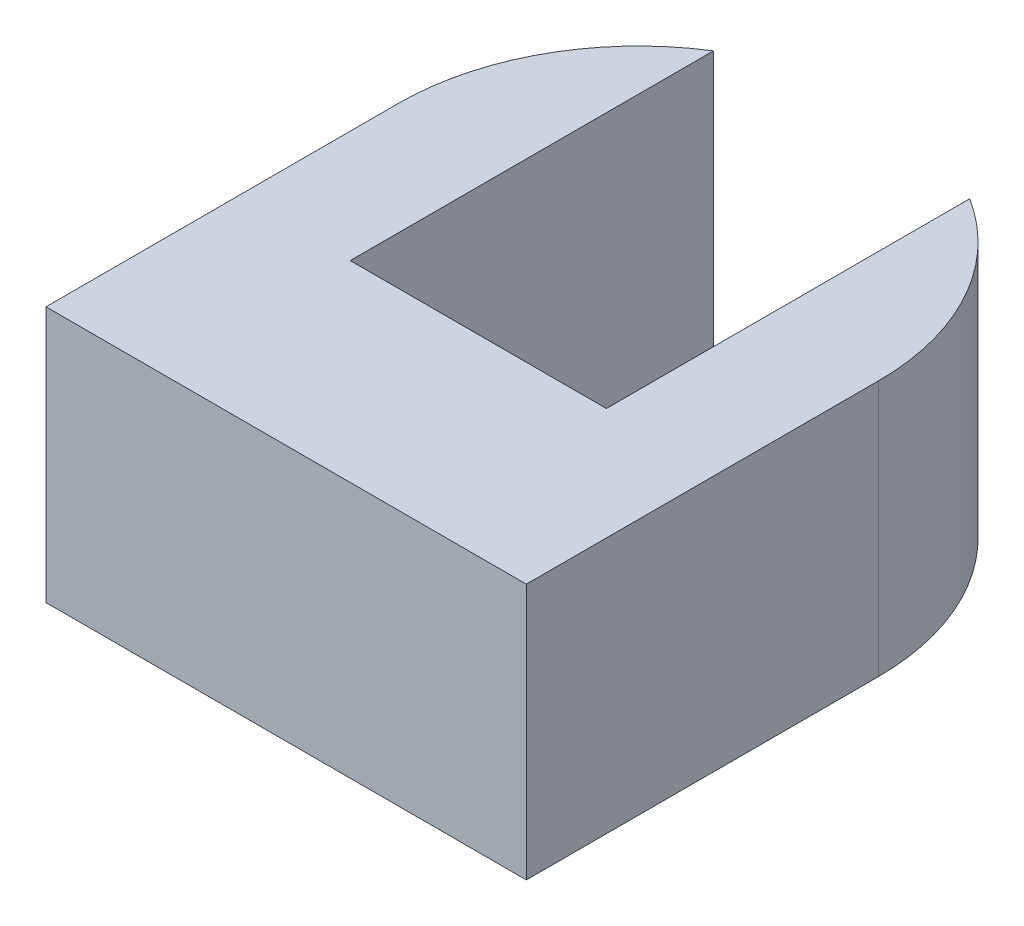
ISO-10303-21;
HEADER;
FILE_DESCRIPTION(('STEP AP214'),'2;1');
FILE_NAME('part.step','',(''),(''),'','','');
FILE_SCHEMA(('AUTOMOTIVE_DESIGN { 1 0 10303 214 1 1 1 1 }'));
ENDSEC;
DATA;
#1=APPLICATION_CONTEXT('core data for automotive mechanical design processes');
#2=APPLICATION_PROTOCOL_DEFINITION('international standard','automotive_design',2000,#1);
#3=PRODUCT_CONTEXT('',#1,'mechanical');
#4=PRODUCT('Part','Part','',(#3));
#5=PRODUCT_RELATED_PRODUCT_CATEGORY('part','',(#4));
#6=PRODUCT_DEFINITION_FORMATION('','',#4);
#7=PRODUCT_DEFINITION_CONTEXT('part definition',#1,'design');
#8=PRODUCT_DEFINITION('design','',#6,#7);
#9=PRODUCT_DEFINITION_SHAPE('','',#8);
#10=(LENGTH_UNIT() NAMED_UNIT(*) SI_UNIT(.MILLI.,.METRE.));
#11=(NAMED_UNIT(*) PLANE_ANGLE_UNIT() SI_UNIT($,.RADIAN.));
#12=(NAMED_UNIT(*) SI_UNIT($,.STERADIAN.) SOLID_ANGLE_UNIT());
#13=UNCERTAINTY_MEASURE_WITH_UNIT(LENGTH_MEASURE(1.E-05),#10,'distance_accuracy_value','');
#14=(GEOMETRIC_REPRESENTATION_CONTEXT(3) GLOBAL_UNCERTAINTY_ASSIGNED_CONTEXT((#13)) GLOBAL_UNIT_ASSIGNED_CONTEXT((#10,
#11,#12)) REPRESENTATION_CONTEXT('',''));
#15=CARTESIAN_POINT('',(0.,0.,0.));
#16=DIRECTION('',(0.,0.,1.));
#17=DIRECTION('',(1.,0.,0.));
#18=AXIS2_PLACEMENT_3D('',#15,#16,#17);
#19=CARTESIAN_POINT('',(7.49999999999999,8.,-11.));
#20=DIRECTION('',(0.,-1.,0.));
#21=DIRECTION('',(0.,0.,-1.));
#22=AXIS2_PLACEMENT_3D('',#19,#20,#21);
#23=CYLINDRICAL_SURFACE('',#22,7.5);
#24=CARTESIAN_POINT('',(7.49999999999999,0.,-11.));
#25=DIRECTION('',(0.,1.,0.));
#26=DIRECTION('',(0.,0.,-1.));
#27=AXIS2_PLACEMENT_3D('',#24,#25,#26);
#28=CIRCLE('',#27,7.5);
#29=CARTESIAN_POINT('',(3.49999999999999,0.,-17.3442887702248));
#30=VERTEX_POINT('',#29);
#31=CARTESIAN_POINT('',(0.,0.,-11.));
#32=VERTEX_POINT('',#31);
#33=EDGE_CURVE('E129',#30,#32,#28,.T.);
#34=ORIENTED_EDGE('',*,*,#33,.T.);
#35=DIRECTION('',(0.,-1.,0.));
#36=VECTOR('',#35,1.);
#37=CARTESIAN_POINT('',(0.,8.,-11.));
#38=LINE('',#37,#36);
#39=CARTESIAN_POINT('',(0.,8.,-11.));
#40=VERTEX_POINT('',#39);
#41=EDGE_CURVE('E11',#40,#32,#38,.T.);
#42=ORIENTED_EDGE('',*,*,#41,.F.);
#43=CARTESIAN_POINT('',(7.49999999999999,8.,-11.));
#44=DIRECTION('',(0.,1.,0.));
#45=DIRECTION('',(0.,0.,-1.));
#46=AXIS2_PLACEMENT_3D('',#43,#44,#45);
#47=CIRCLE('',#46,7.5);
#48=CARTESIAN_POINT('',(3.49999999999999,8.,-17.3442887702248));
#49=VERTEX_POINT('',#48);
#50=EDGE_CURVE('E143',#49,#40,#47,.T.);
#51=ORIENTED_EDGE('',*,*,#50,.F.);
#52=DIRECTION('',(0.,-1.,0.));
#53=VECTOR('',#52,1.);
#54=CARTESIAN_POINT('',(3.49999999999999,8.,-17.3442887702248));
#55=LINE('',#54,#53);
#56=EDGE_CURVE('E125',#49,#30,#55,.T.);
#57=ORIENTED_EDGE('',*,*,#56,.T.);
#58=EDGE_LOOP('',(#34,#42,#51,#57));
#59=FACE_BOUND('',#58,.T.);
#60=ADVANCED_FACE('F33',(#59),#23,.T.);
#61=CARTESIAN_POINT('',(0.,8.,-11.));
#62=DIRECTION('',(1.,0.,0.));
#63=DIRECTION('',(0.,0.,-1.));
#64=AXIS2_PLACEMENT_3D('',#61,#62,#63);
#65=PLANE('',#64);
#66=DIRECTION('',(0.,0.,1.));
#67=VECTOR('',#66,1.);
#68=CARTESIAN_POINT('',(0.,0.,-11.));
#69=LINE('',#68,#67);
#70=CARTESIAN_POINT('',(0.,0.,0.));
#71=VERTEX_POINT('',#70);
#72=EDGE_CURVE('E132',#32,#71,#69,.T.);
#73=ORIENTED_EDGE('',*,*,#72,.T.);
#74=DIRECTION('',(0.,-1.,0.));
#75=VECTOR('',#74,1.);
#76=CARTESIAN_POINT('',(0.,8.,0.));
#77=LINE('',#76,#75);
#78=CARTESIAN_POINT('',(0.,8.,0.));
#79=VERTEX_POINT('',#78);
#80=EDGE_CURVE('E41',#79,#71,#77,.T.);
#81=ORIENTED_EDGE('',*,*,#80,.F.);
#82=DIRECTION('',(0.,0.,1.));
#83=VECTOR('',#82,1.);
#84=CARTESIAN_POINT('',(0.,8.,-11.));
#85=LINE('',#84,#83);
#86=EDGE_CURVE('E92',#40,#79,#85,.T.);
#87=ORIENTED_EDGE('',*,*,#86,.F.);
#88=ORIENTED_EDGE('',*,*,#41,.T.);
#89=EDGE_LOOP('',(#73,#81,#87,#88));
#90=FACE_BOUND('',#89,.T.);
#91=ADVANCED_FACE('F178',(#90),#65,.F.);
#92=CARTESIAN_POINT('',(0.,8.,0.));
#93=DIRECTION('',(0.,0.,-1.));
#94=DIRECTION('',(-1.,0.,0.));
#95=AXIS2_PLACEMENT_3D('',#92,#93,#94);
#96=PLANE('',#95);
#97=DIRECTION('',(1.,0.,0.));
#98=VECTOR('',#97,1.);
#99=CARTESIAN_POINT('',(0.,0.,0.));
#100=LINE('',#99,#98);
#101=CARTESIAN_POINT('',(15.,0.,0.));
#102=VERTEX_POINT('',#101);
#103=EDGE_CURVE('E134',#71,#102,#100,.T.);
#104=ORIENTED_EDGE('',*,*,#103,.T.);
#105=DIRECTION('',(0.,-1.,0.));
#106=VECTOR('',#105,1.);
#107=CARTESIAN_POINT('',(15.,8.,0.));
#108=LINE('',#107,#106);
#109=CARTESIAN_POINT('',(15.,8.,0.));
#110=VERTEX_POINT('',#109);
#111=EDGE_CURVE('E150',#110,#102,#108,.T.);
#112=ORIENTED_EDGE('',*,*,#111,.F.);
#113=DIRECTION('',(1.,0.,0.));
#114=VECTOR('',#113,1.);
#115=CARTESIAN_POINT('',(0.,8.,0.));
#116=LINE('',#115,#114);
#117=EDGE_CURVE('E158',#79,#110,#116,.T.);
#118=ORIENTED_EDGE('',*,*,#117,.F.);
#119=ORIENTED_EDGE('',*,*,#80,.T.);
#120=EDGE_LOOP('',(#104,#112,#118,#119));
#121=FACE_BOUND('',#120,.T.);
#122=ADVANCED_FACE('F156',(#121),#96,.F.);
#123=CARTESIAN_POINT('',(15.,8.,0.));
#124=DIRECTION('',(-1.,0.,0.));
#125=DIRECTION('',(0.,0.,1.));
#126=AXIS2_PLACEMENT_3D('',#123,#124,#125);
#127=PLANE('',#126);
#128=DIRECTION('',(0.,0.,-1.));
#129=VECTOR('',#128,1.);
#130=CARTESIAN_POINT('',(15.,0.,0.));
#131=LINE('',#130,#129);
#132=CARTESIAN_POINT('',(15.,0.,-11.));
#133=VERTEX_POINT('',#132);
#134=EDGE_CURVE('E136',#102,#133,#131,.T.);
#135=ORIENTED_EDGE('',*,*,#134,.T.);
#136=DIRECTION('',(0.,-1.,0.));
#137=VECTOR('',#136,1.);
#138=CARTESIAN_POINT('',(15.,8.,-11.));
#139=LINE('',#138,#137);
#140=CARTESIAN_POINT('',(15.,8.,-11.));
#141=VERTEX_POINT('',#140);
#142=EDGE_CURVE('E147',#141,#133,#139,.T.);
#143=ORIENTED_EDGE('',*,*,#142,.F.);
#144=DIRECTION('',(0.,0.,-1.));
#145=VECTOR('',#144,1.);
#146=CARTESIAN_POINT('',(15.,8.,0.));
#147=LINE('',#146,#145);
#148=EDGE_CURVE('E170',#110,#141,#147,.T.);
#149=ORIENTED_EDGE('',*,*,#148,.F.);
#150=ORIENTED_EDGE('',*,*,#111,.T.);
#151=EDGE_LOOP('',(#135,#143,#149,#150));
#152=FACE_BOUND('',#151,.T.);
#153=ADVANCED_FACE('F166',(#152),#127,.F.);
#154=CARTESIAN_POINT('',(7.49999999999999,8.,-11.));
#155=DIRECTION('',(0.,-1.,0.));
#156=DIRECTION('',(0.,0.,-1.));
#157=AXIS2_PLACEMENT_3D('',#154,#155,#156);
#158=CYLINDRICAL_SURFACE('',#157,7.5);
#159=CARTESIAN_POINT('',(7.49999999999999,0.,-11.));
#160=DIRECTION('',(0.,1.,0.));
#161=DIRECTION('',(0.,0.,1.));
#162=AXIS2_PLACEMENT_3D('',#159,#160,#161);
#163=CIRCLE('',#162,7.5);
#164=CARTESIAN_POINT('',(11.5,0.,-17.3442887702248));
#165=VERTEX_POINT('',#164);
#166=EDGE_CURVE('E138',#133,#165,#163,.T.);
#167=ORIENTED_EDGE('',*,*,#166,.T.);
#168=DIRECTION('',(0.,-1.,0.));
#169=VECTOR('',#168,1.);
#170=CARTESIAN_POINT('',(11.5,8.,-17.3442887702248));
#171=LINE('',#170,#169);
#172=CARTESIAN_POINT('',(11.5,8.,-17.3442887702248));
#173=VERTEX_POINT('',#172);
#174=EDGE_CURVE('E120',#173,#165,#171,.T.);
#175=ORIENTED_EDGE('',*,*,#174,.F.);
#176=CARTESIAN_POINT('',(7.49999999999999,8.,-11.));
#177=DIRECTION('',(0.,1.,0.));
#178=DIRECTION('',(0.,0.,1.));
#179=AXIS2_PLACEMENT_3D('',#176,#177,#178);
#180=CIRCLE('',#179,7.5);
#181=EDGE_CURVE('E111',#141,#173,#180,.T.);
#182=ORIENTED_EDGE('',*,*,#181,.F.);
#183=ORIENTED_EDGE('',*,*,#142,.T.);
#184=EDGE_LOOP('',(#167,#175,#182,#183));
#185=FACE_BOUND('',#184,.T.);
#186=ADVANCED_FACE('F169',(#185),#158,.T.);
#187=CARTESIAN_POINT('',(11.5,8.,-6.));
#188=DIRECTION('',(1.,0.,0.));
#189=DIRECTION('',(0.,0.,-1.));
#190=AXIS2_PLACEMENT_3D('',#187,#188,#189);
#191=PLANE('',#190);
#192=DIRECTION('',(0.,0.,1.));
#193=VECTOR('',#192,1.);
#194=CARTESIAN_POINT('',(11.5,0.,-6.));
#195=LINE('',#194,#193);
#196=CARTESIAN_POINT('',(11.5,0.,-6.));
#197=VERTEX_POINT('',#196);
#198=EDGE_CURVE('E119',#165,#197,#195,.T.);
#199=ORIENTED_EDGE('',*,*,#198,.T.);
#200=DIRECTION('',(0.,-1.,0.));
#201=VECTOR('',#200,1.);
#202=CARTESIAN_POINT('',(11.5,8.,-6.));
#203=LINE('',#202,#201);
#204=CARTESIAN_POINT('',(11.5,8.,-6.));
#205=VERTEX_POINT('',#204);
#206=EDGE_CURVE('E116',#205,#197,#203,.T.);
#207=ORIENTED_EDGE('',*,*,#206,.F.);
#208=DIRECTION('',(0.,0.,1.));
#209=VECTOR('',#208,1.);
#210=CARTESIAN_POINT('',(11.5,8.,-6.));
#211=LINE('',#210,#209);
#212=EDGE_CURVE('E105',#173,#205,#211,.T.);
#213=ORIENTED_EDGE('',*,*,#212,.F.);
#214=ORIENTED_EDGE('',*,*,#174,.T.);
#215=EDGE_LOOP('',(#199,#207,#213,#214));
#216=FACE_BOUND('',#215,.T.);
#217=ADVANCED_FACE('F117',(#216),#191,.F.);
#218=CARTESIAN_POINT('',(3.49999999999999,8.,-6.));
#219=DIRECTION('',(0.,0.,1.));
#220=DIRECTION('',(1.,0.,0.));
#221=AXIS2_PLACEMENT_3D('',#218,#219,#220);
#222=PLANE('',#221);
#223=DIRECTION('',(-1.,0.,0.));
#224=VECTOR('',#223,1.);
#225=CARTESIAN_POINT('',(3.49999999999999,0.,-6.));
#226=LINE('',#225,#224);
#227=CARTESIAN_POINT('',(3.49999999999999,0.,-6.));
#228=VERTEX_POINT('',#227);
#229=EDGE_CURVE('E78',#197,#228,#226,.T.);
#230=ORIENTED_EDGE('',*,*,#229,.T.);
#231=DIRECTION('',(0.,-1.,0.));
#232=VECTOR('',#231,1.);
#233=CARTESIAN_POINT('',(3.49999999999999,8.,-6.));
#234=LINE('',#233,#232);
#235=CARTESIAN_POINT('',(3.49999999999999,8.,-6.));
#236=VERTEX_POINT('',#235);
#237=EDGE_CURVE('E121',#236,#228,#234,.T.);
#238=ORIENTED_EDGE('',*,*,#237,.F.);
#239=DIRECTION('',(-1.,0.,0.));
#240=VECTOR('',#239,1.);
#241=CARTESIAN_POINT('',(3.49999999999999,8.,-6.));
#242=LINE('',#241,#240);
#243=EDGE_CURVE('E109',#205,#236,#242,.T.);
#244=ORIENTED_EDGE('',*,*,#243,.F.);
#245=ORIENTED_EDGE('',*,*,#206,.T.);
#246=EDGE_LOOP('',(#230,#238,#244,#245));
#247=FACE_BOUND('',#246,.T.);
#248=ADVANCED_FACE('F123',(#247),#222,.F.);
#249=CARTESIAN_POINT('',(3.49999999999999,8.,-17.3442887702248));
#250=DIRECTION('',(-1.,0.,0.));
#251=DIRECTION('',(0.,0.,1.));
#252=AXIS2_PLACEMENT_3D('',#249,#250,#251);
#253=PLANE('',#252);
#254=DIRECTION('',(0.,0.,-1.));
#255=VECTOR('',#254,1.);
#256=CARTESIAN_POINT('',(3.49999999999999,0.,-17.3442887702248));
#257=LINE('',#256,#255);
#258=EDGE_CURVE('E84',#228,#30,#257,.T.);
#259=ORIENTED_EDGE('',*,*,#258,.T.);
#260=ORIENTED_EDGE('',*,*,#56,.F.);
#261=DIRECTION('',(0.,0.,-1.));
#262=VECTOR('',#261,1.);
#263=CARTESIAN_POINT('',(3.49999999999999,8.,-17.3442887702248));
#264=LINE('',#263,#262);
#265=EDGE_CURVE('E49',#236,#49,#264,.T.);
#266=ORIENTED_EDGE('',*,*,#265,.F.);
#267=ORIENTED_EDGE('',*,*,#237,.T.);
#268=EDGE_LOOP('',(#259,#260,#266,#267));
#269=FACE_BOUND('',#268,.T.);
#270=ADVANCED_FACE('F194',(#269),#253,.F.);
#271=CARTESIAN_POINT('',(7.49999999999999,8.,-11.));
#272=DIRECTION('',(0.,-1.,0.));
#273=DIRECTION('',(0.,0.,-1.));
#274=AXIS2_PLACEMENT_3D('',#271,#272,#273);
#275=PLANE('',#274);
#276=ORIENTED_EDGE('',*,*,#50,.T.);
#277=ORIENTED_EDGE('',*,*,#86,.T.);
#278=ORIENTED_EDGE('',*,*,#117,.T.);
#279=ORIENTED_EDGE('',*,*,#148,.T.);
#280=ORIENTED_EDGE('',*,*,#181,.T.);
#281=ORIENTED_EDGE('',*,*,#212,.T.);
#282=ORIENTED_EDGE('',*,*,#243,.T.);
#283=ORIENTED_EDGE('',*,*,#265,.T.);
#284=EDGE_LOOP('',(#276,#277,#278,#279,#280,#281,#282,#283));
#285=FACE_BOUND('',#284,.T.);
#286=ADVANCED_FACE('F107',(#285),#275,.F.);
#287=CARTESIAN_POINT('',(7.49999999999999,0.,-11.));
#288=DIRECTION('',(0.,-1.,0.));
#289=DIRECTION('',(0.,0.,-1.));
#290=AXIS2_PLACEMENT_3D('',#287,#288,#289);
#291=PLANE('',#290);
#292=ORIENTED_EDGE('',*,*,#33,.F.);
#293=ORIENTED_EDGE('',*,*,#258,.F.);
#294=ORIENTED_EDGE('',*,*,#229,.F.);
#295=ORIENTED_EDGE('',*,*,#198,.F.);
#296=ORIENTED_EDGE('',*,*,#166,.F.);
#297=ORIENTED_EDGE('',*,*,#134,.F.);
#298=ORIENTED_EDGE('',*,*,#103,.F.);
#299=ORIENTED_EDGE('',*,*,#72,.F.);
#300=EDGE_LOOP('',(#292,#293,#294,#295,#296,#297,#298,#299));
#301=FACE_BOUND('',#300,.T.);
#302=ADVANCED_FACE('F162',(#301),#291,.T.);
#303=CLOSED_SHELL('',(#60,#91,#122,#153,#186,#217,#248,#270,#286,#302));
#304=MANIFOLD_SOLID_BREP('B2',#303);
#305=ADVANCED_BREP_SHAPE_REPRESENTATION('',(#18,#304),#14);
#306=SHAPE_DEFINITION_REPRESENTATION(#9,#305);
ENDSEC;
END-ISO-10303-21;
